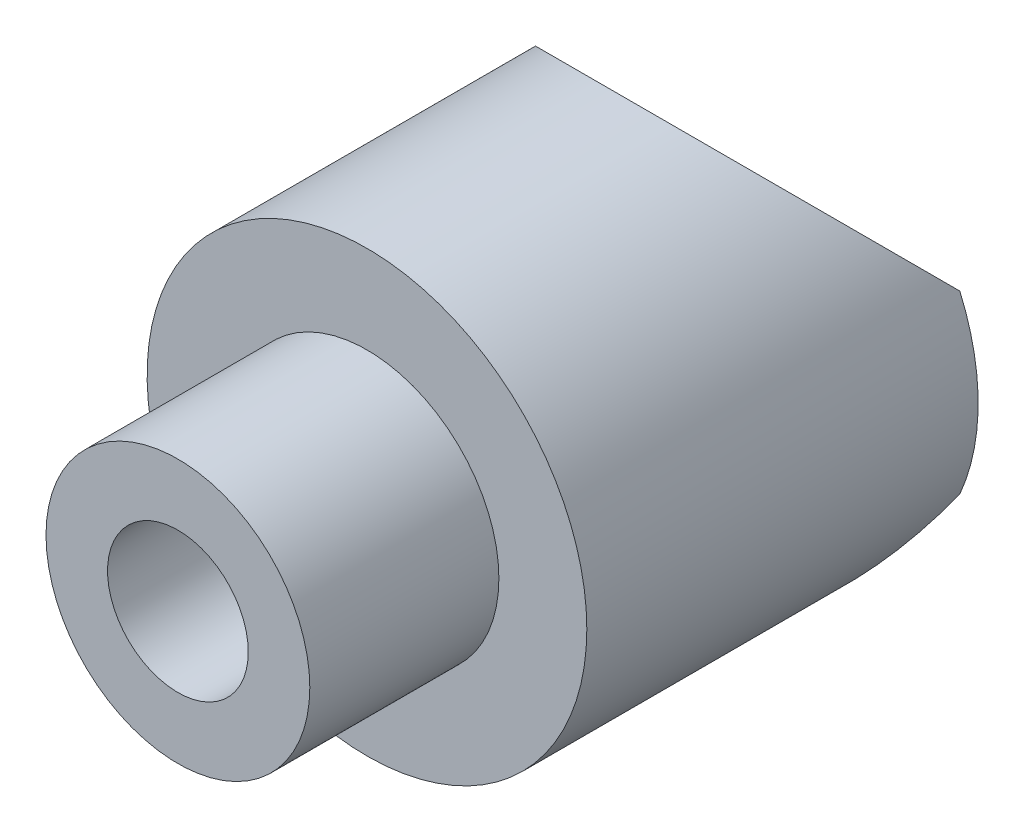
ISO-10303-21;
HEADER;
FILE_DESCRIPTION(('STEP AP214'),'2;1');
FILE_NAME('part.step','',(''),(''),'','','');
FILE_SCHEMA(('AUTOMOTIVE_DESIGN { 1 0 10303 214 1 1 1 1 }'));
ENDSEC;
DATA;
#1=APPLICATION_CONTEXT('core data for automotive mechanical design processes');
#2=APPLICATION_PROTOCOL_DEFINITION('international standard','automotive_design',2000,#1);
#3=PRODUCT_CONTEXT('',#1,'mechanical');
#4=PRODUCT('Part','Part','',(#3));
#5=PRODUCT_RELATED_PRODUCT_CATEGORY('part','',(#4));
#6=PRODUCT_DEFINITION_FORMATION('','',#4);
#7=PRODUCT_DEFINITION_CONTEXT('part definition',#1,'design');
#8=PRODUCT_DEFINITION('design','',#6,#7);
#9=PRODUCT_DEFINITION_SHAPE('','',#8);
#10=(LENGTH_UNIT() NAMED_UNIT(*) SI_UNIT(.MILLI.,.METRE.));
#11=(NAMED_UNIT(*) PLANE_ANGLE_UNIT() SI_UNIT($,.RADIAN.));
#12=(NAMED_UNIT(*) SI_UNIT($,.STERADIAN.) SOLID_ANGLE_UNIT());
#13=UNCERTAINTY_MEASURE_WITH_UNIT(LENGTH_MEASURE(1.E-05),#10,'distance_accuracy_value','');
#14=(GEOMETRIC_REPRESENTATION_CONTEXT(3) GLOBAL_UNCERTAINTY_ASSIGNED_CONTEXT((#13)) GLOBAL_UNIT_ASSIGNED_CONTEXT((#10,
#11,#12)) REPRESENTATION_CONTEXT('',''));
#15=CARTESIAN_POINT('',(0.,0.,0.));
#16=DIRECTION('',(0.,0.,1.));
#17=DIRECTION('',(1.,0.,0.));
#18=AXIS2_PLACEMENT_3D('',#15,#16,#17);
#19=CARTESIAN_POINT('',(0.,0.,0.));
#20=DIRECTION('',(0.,0.,1.));
#21=DIRECTION('',(1.,0.,0.));
#22=AXIS2_PLACEMENT_3D('',#19,#20,#21);
#23=CYLINDRICAL_SURFACE('',#22,1.6);
#24=CARTESIAN_POINT('',(1.6,0.,2.73708771293081));
#25=CARTESIAN_POINT('',(1.59999974373874,0.0873662379829126,2.73708798780949));
#26=CARTESIAN_POINT('',(1.59281993166463,0.174735503752896,2.73953109593308));
#27=CARTESIAN_POINT('',(1.56437769172507,0.346899587621834,2.7489937190314));
#28=CARTESIAN_POINT('',(1.54311199666736,0.43169380366987,2.75601429573487));
#29=CARTESIAN_POINT('',(1.48731021882536,0.59618810164033,2.77375701461625));
#30=CARTESIAN_POINT('',(1.45279850166911,0.675897225301942,2.784472356737));
#31=CARTESIAN_POINT('',(1.37156634454408,0.828417641022145,2.80838765550231));
#32=CARTESIAN_POINT('',(1.32484355228541,0.90122760036871,2.82158809072754));
#33=CARTESIAN_POINT('',(1.21871241953147,1.0405063951317,2.84951968764675));
#34=CARTESIAN_POINT('',(1.15893934729319,1.10669016547474,2.86428678030524));
#35=CARTESIAN_POINT('',(1.02918412233017,1.22828642586389,2.89338280213669));
#36=CARTESIAN_POINT('',(0.959200473487308,1.28369733462219,2.90771166672489));
#37=CARTESIAN_POINT('',(0.80894942246277,1.38344538529999,2.93472953085556));
#38=CARTESIAN_POINT('',(0.728476687860992,1.42748714930926,2.94737131144711));
#39=CARTESIAN_POINT('',(0.560792193508547,1.50129856396563,2.96916970645467));
#40=CARTESIAN_POINT('',(0.473582105406685,1.53107174176268,2.97832718206453));
#41=CARTESIAN_POINT('',(0.297884710119076,1.57454377922836,2.99187078015161));
#42=CARTESIAN_POINT('',(0.209529388874191,1.58873025766161,2.99640130994182));
#43=CARTESIAN_POINT('',(0.0315841299204916,1.60217310550111,3.00069148119392));
#44=CARTESIAN_POINT('',(-0.058005508830848,1.6014330288018,3.00045225829628));
#45=CARTESIAN_POINT('',(-0.232437491666959,1.58536049802763,2.9953294799159));
#46=CARTESIAN_POINT('',(-0.317334316303528,1.57055700215938,2.99061428137964));
#47=CARTESIAN_POINT('',(-0.483368293649631,1.52764817675885,2.97727793973528));
#48=CARTESIAN_POINT('',(-0.564505196993057,1.49954196634407,2.96865653796686));
#49=CARTESIAN_POINT('',(-0.721913949614886,1.43049676748218,2.94825462002066));
#50=CARTESIAN_POINT('',(-0.798111771873499,1.38940081840644,2.93643573330445));
#51=CARTESIAN_POINT('',(-0.94269143741114,1.29566979310145,2.9108788342044));
#52=CARTESIAN_POINT('',(-1.01107122500451,1.24303169252938,2.89714031917112));
#53=CARTESIAN_POINT('',(-1.14122552524351,1.12501235826681,2.86849469180912));
#54=CARTESIAN_POINT('',(-1.2025821378014,1.05917563694248,2.85356274482591));
#55=CARTESIAN_POINT('',(-1.31351207358059,0.918011739020401,2.8247258395209));
#56=CARTESIAN_POINT('',(-1.36308386476992,0.842683330444557,2.81082101488724));
#57=CARTESIAN_POINT('',(-1.44955524382539,0.683443259706725,2.78548357380621));
#58=CARTESIAN_POINT('',(-1.48629250439436,0.599437924624755,2.77408325840668));
#59=CARTESIAN_POINT('',(-1.54496461752815,0.425979193607758,2.75542251488665));
#60=CARTESIAN_POINT('',(-1.56690509705448,0.336527882808808,2.74816051319963));
#61=CARTESIAN_POINT('',(-1.59453893191269,0.158736089909473,2.73895031775712));
#62=CARTESIAN_POINT('',(-1.60087507754216,0.0705063516754292,2.73679204354283));
#63=CARTESIAN_POINT('',(-1.59893067907134,-0.10576427053874,2.73744898777773));
#64=CARTESIAN_POINT('',(-1.5906525297045,-0.193805183093498,2.74026339139206));
#65=CARTESIAN_POINT('',(-1.56029013344713,-0.364377027343671,2.7503404414304));
#66=CARTESIAN_POINT('',(-1.53863886571376,-0.44699414669862,2.75746344492905));
#67=CARTESIAN_POINT('',(-1.48265712290061,-0.607411159740119,2.77520515081817));
#68=CARTESIAN_POINT('',(-1.44832451458384,-0.685210240370542,2.78582444131636));
#69=CARTESIAN_POINT('',(-1.3667895840503,-0.836347847161751,2.80975442366493));
#70=CARTESIAN_POINT('',(-1.31923446955668,-0.909484558809298,2.8231358439457));
#71=CARTESIAN_POINT('',(-1.2130119976528,-1.0469734221838,2.85093919332853));
#72=CARTESIAN_POINT('',(-1.15434161483455,-1.11132317400831,2.86536140505509));
#73=CARTESIAN_POINT('',(-1.02450097804918,-1.2323191106342,2.89438512522789));
#74=CARTESIAN_POINT('',(-0.952895991490041,-1.28850480158372,2.90896684906862));
#75=CARTESIAN_POINT('',(-0.800918884886268,-1.38808507727672,2.93603865529219));
#76=CARTESIAN_POINT('',(-0.720547139344916,-1.43148020812148,2.94852882696538));
#77=CARTESIAN_POINT('',(-0.55378376090426,-1.50383599726771,2.96994289161967));
#78=CARTESIAN_POINT('',(-0.467439525556669,-1.53289811841377,2.97889176140864));
#79=CARTESIAN_POINT('',(-0.290749982825202,-1.57598410411073,2.9923242466308));
#80=CARTESIAN_POINT('',(-0.200406004983306,-1.5900129273269,2.99680933438748));
#81=CARTESIAN_POINT('',(-0.022510635162504,-1.60221570789975,3.00070652519304));
#82=CARTESIAN_POINT('',(0.0649911044944401,-1.6010533150299,3.00033097908979));
#83=CARTESIAN_POINT('',(0.23849543791028,-1.58452291522177,2.99506275597099));
#84=CARTESIAN_POINT('',(0.324498137176768,-1.56915591219964,2.99017039818283));
#85=CARTESIAN_POINT('',(0.491403041592258,-1.52508172923404,2.97648934157747));
#86=CARTESIAN_POINT('',(0.572358868573166,-1.49655962755433,2.96775477499445));
#87=CARTESIAN_POINT('',(0.728372537104163,-1.42715339042773,2.9472892397229));
#88=CARTESIAN_POINT('',(0.80342934194862,-1.38626708816543,2.93555774588147));
#89=CARTESIAN_POINT('',(0.948377856654681,-1.29163889221453,2.90980554197593));
#90=CARTESIAN_POINT('',(1.01799645273276,-1.23749676379537,2.89571902538267));
#91=CARTESIAN_POINT('',(1.14737920780259,-1.11859072415985,2.86702383992102));
#92=CARTESIAN_POINT('',(1.20714033786284,-1.05382356030674,2.85241501223218));
#93=CARTESIAN_POINT('',(1.31724196523931,-0.912773354362987,2.82371532498013));
#94=CARTESIAN_POINT('',(1.36717640898326,-0.836164997925323,2.80966084431258));
#95=CARTESIAN_POINT('',(1.45341388681981,-0.675215294330327,2.78430967821654));
#96=CARTESIAN_POINT('',(1.48972176586894,-0.590876708969375,2.77301201309667));
#97=CARTESIAN_POINT('',(1.5454160638658,-0.423017158885164,2.75525868307298));
#98=CARTESIAN_POINT('',(1.56582251059464,-0.339864844083436,2.74851573857385));
#99=CARTESIAN_POINT('',(1.59311272174624,-0.171142201147666,2.73943073150288));
#100=CARTESIAN_POINT('',(1.60000025100005,-0.0855725529430703,2.73708744369556));
#101=CARTESIAN_POINT('',(1.6,0.,2.73708771293081));
#102=B_SPLINE_CURVE_WITH_KNOTS('',3,(#24,#25,#26,#27,#28,#29,#30,#31,#32,#33,#34,#35,#36,#37,
#38,#39,#40,#41,#42,#43,#44,#45,#46,#47,#48,#49,#50,#51,#52,#53,#54,#55,#56,#57,#58,#59,#60,#61,
#62,#63,#64,#65,#66,#67,#68,#69,#70,#71,#72,#73,#74,#75,#76,#77,#78,#79,#80,#81,#82,#83,#84,#85,
#86,#87,#88,#89,#90,#91,#92,#93,#94,#95,#96,#97,#98,#99,#100,#101),.UNSPECIFIED.,.T.,.F.,(4,2,2,
2,2,2,2,2,2,2,2,2,2,2,2,2,2,2,2,2,2,2,2,2,2,2,2,2,2,2,2,2,2,2,2,2,2,2,4),(0.,0.261782337086142,
0.523625415332401,0.784989132393395,1.04640323461352,1.31636217216967,1.58636070561341,
1.86279377491072,2.13915847552485,2.4066067441957,2.67399133630597,2.93170127402817,
3.18942827924008,3.45039690075846,3.71143398470616,3.98385068324257,4.25630277672778,
4.53208561817767,4.80776352492637,5.07187991332532,5.33595302699623,5.59189456344124,
5.84787917362796,6.1114865329221,6.37516574550518,6.65038672388641,6.92559594982595,
7.19882796886114,7.47196983578454,7.73322052820115,7.99445275803873,8.25211685877031,
8.50982614110575,8.77656491371797,9.04338549583878,9.31960601010001,9.59572822026814,
9.85220743369917,10.1086152110862),.UNSPECIFIED.);
#103=CARTESIAN_POINT('',(1.6,0.,2.73708771293081));
#104=VERTEX_POINT('',#103);
#105=EDGE_CURVE('E43',#104,#104,#102,.T.);
#106=ORIENTED_EDGE('',*,*,#105,.F.);
#107=EDGE_LOOP('',(#106));
#108=FACE_BOUND('',#107,.T.);
#109=CARTESIAN_POINT('',(0.,0.,13.2));
#110=DIRECTION('',(0.,0.,1.));
#111=DIRECTION('',(1.,0.,0.));
#112=AXIS2_PLACEMENT_3D('',#109,#110,#111);
#113=CIRCLE('',#112,1.6);
#114=CARTESIAN_POINT('',(1.6,0.,13.2));
#115=VERTEX_POINT('',#114);
#116=EDGE_CURVE('E101',#115,#115,#113,.F.);
#117=ORIENTED_EDGE('',*,*,#116,.F.);
#118=EDGE_LOOP('',(#117));
#119=FACE_BOUND('',#118,.T.);
#120=ADVANCED_FACE('F39',(#108,#119),#23,.F.);
#121=CARTESIAN_POINT('',(0.,0.,9.));
#122=DIRECTION('',(0.,0.,1.));
#123=DIRECTION('',(1.,0.,0.));
#124=AXIS2_PLACEMENT_3D('',#121,#122,#123);
#125=CYLINDRICAL_SURFACE('',#124,3.);
#126=CARTESIAN_POINT('',(0.,0.,8.9));
#127=DIRECTION('',(0.,0.,1.));
#128=DIRECTION('',(1.,0.,0.));
#129=AXIS2_PLACEMENT_3D('',#126,#127,#128);
#130=CIRCLE('',#129,3.);
#131=CARTESIAN_POINT('',(3.,0.,8.9));
#132=VERTEX_POINT('',#131);
#133=EDGE_CURVE('E97',#132,#132,#130,.T.);
#134=ORIENTED_EDGE('',*,*,#133,.T.);
#135=EDGE_LOOP('',(#134));
#136=FACE_BOUND('',#135,.T.);
#137=CARTESIAN_POINT('',(0.,0.,13.2));
#138=DIRECTION('',(0.,0.,1.));
#139=DIRECTION('',(1.,0.,0.));
#140=AXIS2_PLACEMENT_3D('',#137,#138,#139);
#141=CIRCLE('',#140,3.);
#142=CARTESIAN_POINT('',(3.,0.,13.2));
#143=VERTEX_POINT('',#142);
#144=EDGE_CURVE('E104',#143,#143,#141,.T.);
#145=ORIENTED_EDGE('',*,*,#144,.F.);
#146=EDGE_LOOP('',(#145));
#147=FACE_BOUND('',#146,.T.);
#148=ADVANCED_FACE('F112',(#136,#147),#125,.T.);
#149=CARTESIAN_POINT('',(0.,0.,15.));
#150=DIRECTION('',(0.,0.,-1.));
#151=DIRECTION('',(-1.,0.,0.));
#152=AXIS2_PLACEMENT_3D('',#149,#150,#151);
#153=CYLINDRICAL_SURFACE('',#152,5.);
#154=CARTESIAN_POINT('',(0.,0.,0.));
#155=DIRECTION('',(0.,0.,1.));
#156=DIRECTION('',(1.,0.,0.));
#157=AXIS2_PLACEMENT_3D('',#154,#155,#156);
#158=CIRCLE('',#157,5.);
#159=CARTESIAN_POINT('',(4.58257569495584,-2.,0.));
#160=VERTEX_POINT('',#159);
#161=CARTESIAN_POINT('',(4.58257569495584,2.,0.));
#162=VERTEX_POINT('',#161);
#163=EDGE_CURVE('E81',#160,#162,#158,.T.);
#164=ORIENTED_EDGE('',*,*,#163,.T.);
#165=CARTESIAN_POINT('',(0.,0.,-2.));
#166=DIRECTION('',(0.,0.707106781186547,-0.707106781186547));
#167=DIRECTION('',(0.,-0.707106781186547,-0.707106781186547));
#168=AXIS2_PLACEMENT_3D('',#165,#166,#167);
#169=ELLIPSE('',#168,7.07106781186548,5.);
#170=CARTESIAN_POINT('',(-4.58257569495584,1.99999999999999,0.));
#171=VERTEX_POINT('',#170);
#172=EDGE_CURVE('E66',#162,#171,#169,.F.);
#173=ORIENTED_EDGE('',*,*,#172,.T.);
#174=CARTESIAN_POINT('',(-4.58257569495584,-1.99999999999999,0.));
#175=VERTEX_POINT('',#174);
#176=EDGE_CURVE('E75',#171,#175,#158,.T.);
#177=ORIENTED_EDGE('',*,*,#176,.T.);
#178=CARTESIAN_POINT('',(0.,0.,-2.));
#179=DIRECTION('',(0.,-0.707106781186547,-0.707106781186547));
#180=DIRECTION('',(0.,0.707106781186547,-0.707106781186547));
#181=AXIS2_PLACEMENT_3D('',#178,#179,#180);
#182=ELLIPSE('',#181,7.07106781186548,5.);
#183=EDGE_CURVE('E61',#175,#160,#182,.F.);
#184=ORIENTED_EDGE('',*,*,#183,.T.);
#185=EDGE_LOOP('',(#164,#173,#177,#184));
#186=FACE_BOUND('',#185,.T.);
#187=CARTESIAN_POINT('',(0.,0.,8.9));
#188=DIRECTION('',(0.,0.,1.));
#189=DIRECTION('',(1.,0.,0.));
#190=AXIS2_PLACEMENT_3D('',#187,#188,#189);
#191=CIRCLE('',#190,5.);
#192=CARTESIAN_POINT('',(5.,0.,8.9));
#193=VERTEX_POINT('',#192);
#194=EDGE_CURVE('E93',#193,#193,#191,.T.);
#195=ORIENTED_EDGE('',*,*,#194,.F.);
#196=EDGE_LOOP('',(#195));
#197=FACE_BOUND('',#196,.T.);
#198=ADVANCED_FACE('F41',(#186,#197),#153,.T.);
#199=CARTESIAN_POINT('',(0.,0.,0.));
#200=DIRECTION('',(0.,0.,1.));
#201=DIRECTION('',(1.,0.,0.));
#202=AXIS2_PLACEMENT_3D('',#199,#200,#201);
#203=PLANE('',#202);
#204=ORIENTED_EDGE('',*,*,#163,.F.);
#205=DIRECTION('',(0.,1.,0.));
#206=VECTOR('',#205,1.);
#207=CARTESIAN_POINT('',(4.58257569495584,-25.,0.));
#208=LINE('',#207,#206);
#209=EDGE_CURVE('E12',#160,#162,#208,.T.);
#210=ORIENTED_EDGE('',*,*,#209,.T.);
#211=EDGE_LOOP('',(#204,#210));
#212=FACE_BOUND('',#211,.T.);
#213=ADVANCED_FACE('F120',(#212),#203,.F.);
#214=ORIENTED_EDGE('',*,*,#176,.F.);
#215=DIRECTION('',(0.,1.,0.));
#216=VECTOR('',#215,1.);
#217=CARTESIAN_POINT('',(-4.58257569495584,-25.,0.));
#218=LINE('',#217,#216);
#219=EDGE_CURVE('E54',#171,#175,#218,.F.);
#220=ORIENTED_EDGE('',*,*,#219,.T.);
#221=EDGE_LOOP('',(#214,#220));
#222=FACE_BOUND('',#221,.T.);
#223=ADVANCED_FACE('F84',(#222),#203,.F.);
#224=CARTESIAN_POINT('',(0.,-25.,-2.));
#225=DIRECTION('',(0.,1.,0.));
#226=DIRECTION('',(0.,0.,1.));
#227=AXIS2_PLACEMENT_3D('',#224,#225,#226);
#228=CYLINDRICAL_SURFACE('',#227,5.);
#229=ORIENTED_EDGE('',*,*,#105,.T.);
#230=EDGE_LOOP('',(#229));
#231=FACE_BOUND('',#230,.T.);
#232=ORIENTED_EDGE('',*,*,#183,.F.);
#233=ORIENTED_EDGE('',*,*,#219,.F.);
#234=ORIENTED_EDGE('',*,*,#172,.F.);
#235=ORIENTED_EDGE('',*,*,#209,.F.);
#236=EDGE_LOOP('',(#232,#233,#234,#235));
#237=FACE_BOUND('',#236,.T.);
#238=ADVANCED_FACE('F70',(#231,#237),#228,.F.);
#239=CARTESIAN_POINT('',(0.,0.,8.9));
#240=DIRECTION('',(0.,0.,1.));
#241=DIRECTION('',(1.,0.,0.));
#242=AXIS2_PLACEMENT_3D('',#239,#240,#241);
#243=PLANE('',#242);
#244=ORIENTED_EDGE('',*,*,#133,.F.);
#245=EDGE_LOOP('',(#244));
#246=FACE_BOUND('',#245,.T.);
#247=ORIENTED_EDGE('',*,*,#194,.T.);
#248=EDGE_LOOP('',(#247));
#249=FACE_BOUND('',#248,.T.);
#250=ADVANCED_FACE('F128',(#246,#249),#243,.T.);
#251=CARTESIAN_POINT('',(0.,0.,13.2));
#252=DIRECTION('',(0.,0.,1.));
#253=DIRECTION('',(1.,0.,0.));
#254=AXIS2_PLACEMENT_3D('',#251,#252,#253);
#255=PLANE('',#254);
#256=ORIENTED_EDGE('',*,*,#144,.T.);
#257=EDGE_LOOP('',(#256));
#258=FACE_BOUND('',#257,.T.);
#259=ORIENTED_EDGE('',*,*,#116,.T.);
#260=EDGE_LOOP('',(#259));
#261=FACE_BOUND('',#260,.T.);
#262=ADVANCED_FACE('F109',(#258,#261),#255,.T.);
#263=CLOSED_SHELL('',(#120,#148,#198,#213,#223,#238,#250,#262));
#264=MANIFOLD_SOLID_BREP('B2',#263);
#265=ADVANCED_BREP_SHAPE_REPRESENTATION('',(#18,#264),#14);
#266=SHAPE_DEFINITION_REPRESENTATION(#9,#265);
ENDSEC;
END-ISO-10303-21;
